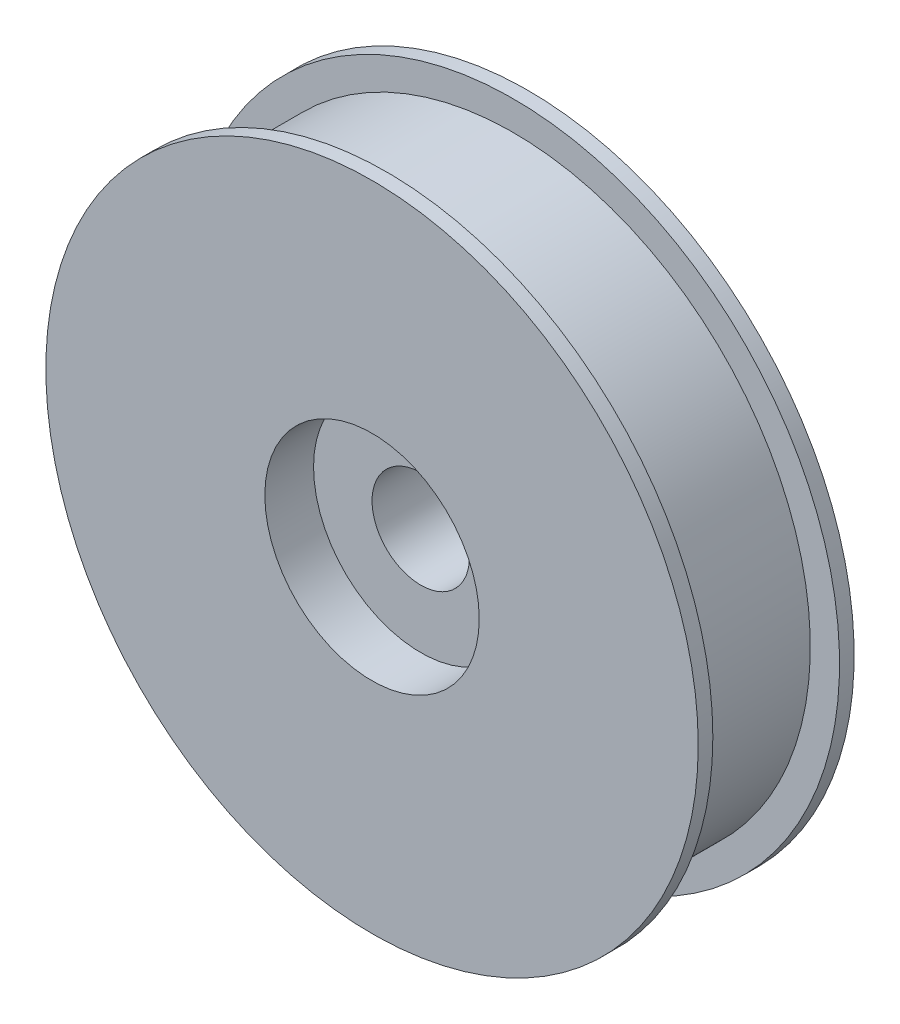
ISO-10303-21;
HEADER;
FILE_DESCRIPTION(('STEP AP214'),'2;1');
FILE_NAME('part.step','',(''),(''),'','','');
FILE_SCHEMA(('AUTOMOTIVE_DESIGN { 1 0 10303 214 1 1 1 1 }'));
ENDSEC;
DATA;
#1=APPLICATION_CONTEXT('core data for automotive mechanical design processes');
#2=APPLICATION_PROTOCOL_DEFINITION('international standard','automotive_design',2000,#1);
#3=PRODUCT_CONTEXT('',#1,'mechanical');
#4=PRODUCT('Part','Part','',(#3));
#5=PRODUCT_RELATED_PRODUCT_CATEGORY('part','',(#4));
#6=PRODUCT_DEFINITION_FORMATION('','',#4);
#7=PRODUCT_DEFINITION_CONTEXT('part definition',#1,'design');
#8=PRODUCT_DEFINITION('design','',#6,#7);
#9=PRODUCT_DEFINITION_SHAPE('','',#8);
#10=(LENGTH_UNIT() NAMED_UNIT(*) SI_UNIT(.MILLI.,.METRE.));
#11=(NAMED_UNIT(*) PLANE_ANGLE_UNIT() SI_UNIT($,.RADIAN.));
#12=(NAMED_UNIT(*) SI_UNIT($,.STERADIAN.) SOLID_ANGLE_UNIT());
#13=UNCERTAINTY_MEASURE_WITH_UNIT(LENGTH_MEASURE(1.E-05),#10,'distance_accuracy_value','');
#14=(GEOMETRIC_REPRESENTATION_CONTEXT(3) GLOBAL_UNCERTAINTY_ASSIGNED_CONTEXT((#13)) GLOBAL_UNIT_ASSIGNED_CONTEXT((#10,
#11,#12)) REPRESENTATION_CONTEXT('',''));
#15=CARTESIAN_POINT('',(0.,0.,0.));
#16=DIRECTION('',(0.,0.,1.));
#17=DIRECTION('',(1.,0.,0.));
#18=AXIS2_PLACEMENT_3D('',#15,#16,#17);
#19=CARTESIAN_POINT('',(0.,0.,-1.5));
#20=DIRECTION('',(0.,0.,1.));
#21=DIRECTION('',(1.,0.,0.));
#22=AXIS2_PLACEMENT_3D('',#19,#20,#21);
#23=CYLINDRICAL_SURFACE('',#22,5.);
#24=CARTESIAN_POINT('',(0.,0.,-1.5));
#25=DIRECTION('',(0.,0.,1.));
#26=DIRECTION('',(1.,0.,0.));
#27=AXIS2_PLACEMENT_3D('',#24,#25,#26);
#28=CIRCLE('',#27,5.);
#29=CARTESIAN_POINT('',(5.,0.,-1.5));
#30=VERTEX_POINT('',#29);
#31=EDGE_CURVE('E55',#30,#30,#28,.T.);
#32=ORIENTED_EDGE('',*,*,#31,.F.);
#33=EDGE_LOOP('',(#32));
#34=FACE_BOUND('',#33,.T.);
#35=CARTESIAN_POINT('',(0.,0.,9.5));
#36=DIRECTION('',(0.,0.,1.));
#37=DIRECTION('',(1.,0.,0.));
#38=AXIS2_PLACEMENT_3D('',#35,#36,#37);
#39=CIRCLE('',#38,5.);
#40=CARTESIAN_POINT('',(5.,0.,9.5));
#41=VERTEX_POINT('',#40);
#42=EDGE_CURVE('E35',#41,#41,#39,.F.);
#43=ORIENTED_EDGE('',*,*,#42,.F.);
#44=EDGE_LOOP('',(#43));
#45=FACE_BOUND('',#44,.T.);
#46=ADVANCED_FACE('F31',(#34,#45),#23,.F.);
#47=CARTESIAN_POINT('',(0.,0.,13.));
#48=DIRECTION('',(0.,0.,-1.));
#49=DIRECTION('',(-1.,0.,0.));
#50=AXIS2_PLACEMENT_3D('',#47,#48,#49);
#51=CYLINDRICAL_SURFACE('',#50,30.47);
#52=CARTESIAN_POINT('',(0.,0.,13.));
#53=DIRECTION('',(0.,0.,1.));
#54=DIRECTION('',(1.,0.,0.));
#55=AXIS2_PLACEMENT_3D('',#52,#53,#54);
#56=CIRCLE('',#55,30.47);
#57=CARTESIAN_POINT('',(-30.47,0.,13.));
#58=VERTEX_POINT('',#57);
#59=EDGE_CURVE('E10',#58,#58,#56,.T.);
#60=CARTESIAN_POINT('',(0.,0.,0.));
#61=DIRECTION('',(0.,0.,-1.));
#62=DIRECTION('',(-1.,0.,0.));
#63=AXIS2_PLACEMENT_3D('',#60,#61,#62);
#64=CIRCLE('',#63,30.47);
#65=CARTESIAN_POINT('',(-30.47,0.,0.));
#66=VERTEX_POINT('',#65);
#67=EDGE_CURVE('E47',#66,#66,#64,.T.);
#68=CARTESIAN_POINT('',(-30.47,0.,13.));
#69=CARTESIAN_POINT('',(-30.47,0.,12.8645833333333));
#70=CARTESIAN_POINT('',(-30.47,0.,12.7291666666667));
#71=CARTESIAN_POINT('',(-30.47,0.,12.4583333333333));
#72=CARTESIAN_POINT('',(-30.47,0.,12.3229166666667));
#73=CARTESIAN_POINT('',(-30.47,0.,12.0520833333333));
#74=CARTESIAN_POINT('',(-30.47,0.,11.9166666666667));
#75=CARTESIAN_POINT('',(-30.47,0.,11.6458333333333));
#76=CARTESIAN_POINT('',(-30.47,0.,11.5104166666667));
#77=CARTESIAN_POINT('',(-30.47,0.,11.2395833333333));
#78=CARTESIAN_POINT('',(-30.47,0.,11.1041666666667));
#79=CARTESIAN_POINT('',(-30.47,0.,10.8333333333333));
#80=CARTESIAN_POINT('',(-30.47,0.,10.6979166666667));
#81=CARTESIAN_POINT('',(-30.47,0.,10.4270833333333));
#82=CARTESIAN_POINT('',(-30.47,0.,10.2916666666667));
#83=CARTESIAN_POINT('',(-30.47,0.,10.0208333333333));
#84=CARTESIAN_POINT('',(-30.47,0.,9.88541666666667));
#85=CARTESIAN_POINT('',(-30.47,0.,9.61458333333333));
#86=CARTESIAN_POINT('',(-30.47,0.,9.47916666666667));
#87=CARTESIAN_POINT('',(-30.47,0.,9.20833333333333));
#88=CARTESIAN_POINT('',(-30.47,0.,9.07291666666666));
#89=CARTESIAN_POINT('',(-30.47,0.,8.80208333333333));
#90=CARTESIAN_POINT('',(-30.47,0.,8.66666666666667));
#91=CARTESIAN_POINT('',(-30.47,0.,8.39583333333333));
#92=CARTESIAN_POINT('',(-30.47,0.,8.26041666666667));
#93=CARTESIAN_POINT('',(-30.47,0.,7.98958333333333));
#94=CARTESIAN_POINT('',(-30.47,0.,7.85416666666667));
#95=CARTESIAN_POINT('',(-30.47,0.,7.58333333333333));
#96=CARTESIAN_POINT('',(-30.47,0.,7.44791666666667));
#97=CARTESIAN_POINT('',(-30.47,0.,7.17708333333333));
#98=CARTESIAN_POINT('',(-30.47,0.,7.04166666666667));
#99=CARTESIAN_POINT('',(-30.47,0.,6.77083333333333));
#100=CARTESIAN_POINT('',(-30.47,0.,6.63541666666667));
#101=CARTESIAN_POINT('',(-30.47,0.,6.36458333333333));
#102=CARTESIAN_POINT('',(-30.47,0.,6.22916666666667));
#103=CARTESIAN_POINT('',(-30.47,0.,5.95833333333333));
#104=CARTESIAN_POINT('',(-30.47,0.,5.82291666666667));
#105=CARTESIAN_POINT('',(-30.47,0.,5.55208333333333));
#106=CARTESIAN_POINT('',(-30.47,0.,5.41666666666667));
#107=CARTESIAN_POINT('',(-30.47,0.,5.14583333333333));
#108=CARTESIAN_POINT('',(-30.47,0.,5.01041666666667));
#109=CARTESIAN_POINT('',(-30.47,0.,4.73958333333333));
#110=CARTESIAN_POINT('',(-30.47,0.,4.60416666666667));
#111=CARTESIAN_POINT('',(-30.47,0.,4.33333333333333));
#112=CARTESIAN_POINT('',(-30.47,0.,4.19791666666667));
#113=CARTESIAN_POINT('',(-30.47,0.,3.92708333333333));
#114=CARTESIAN_POINT('',(-30.47,0.,3.79166666666667));
#115=CARTESIAN_POINT('',(-30.47,0.,3.52083333333333));
#116=CARTESIAN_POINT('',(-30.47,0.,3.38541666666667));
#117=CARTESIAN_POINT('',(-30.47,0.,3.11458333333333));
#118=CARTESIAN_POINT('',(-30.47,0.,2.97916666666667));
#119=CARTESIAN_POINT('',(-30.47,0.,2.70833333333333));
#120=CARTESIAN_POINT('',(-30.47,0.,2.57291666666667));
#121=CARTESIAN_POINT('',(-30.47,0.,2.30208333333333));
#122=CARTESIAN_POINT('',(-30.47,0.,2.16666666666667));
#123=CARTESIAN_POINT('',(-30.47,0.,1.89583333333333));
#124=CARTESIAN_POINT('',(-30.47,0.,1.76041666666667));
#125=CARTESIAN_POINT('',(-30.47,0.,1.48958333333333));
#126=CARTESIAN_POINT('',(-30.47,0.,1.35416666666667));
#127=CARTESIAN_POINT('',(-30.47,0.,1.08333333333333));
#128=CARTESIAN_POINT('',(-30.47,0.,0.947916666666667));
#129=CARTESIAN_POINT('',(-30.47,0.,0.677083333333334));
#130=CARTESIAN_POINT('',(-30.47,0.,0.541666666666667));
#131=CARTESIAN_POINT('',(-30.47,0.,0.270833333333334));
#132=CARTESIAN_POINT('',(-30.47,0.,0.135416666666667));
#133=CARTESIAN_POINT('',(-30.47,0.,0.));
#134=B_SPLINE_CURVE_WITH_KNOTS('',3,(#68,#69,#70,#71,#72,#73,#74,#75,#76,#77,#78,#79,#80,#81,
#82,#83,#84,#85,#86,#87,#88,#89,#90,#91,#92,#93,#94,#95,#96,#97,#98,#99,#100,#101,#102,#103,
#104,#105,#106,#107,#108,#109,#110,#111,#112,#113,#114,#115,#116,#117,#118,#119,#120,#121,#122,
#123,#124,#125,#126,#127,#128,#129,#130,#131,#132,#133),.UNSPECIFIED.,.F.,.F.,(4,2,2,2,2,2,2,2,
2,2,2,2,2,2,2,2,2,2,2,2,2,2,2,2,2,2,2,2,2,2,2,2,4),(0.,0.40625,0.812500000000001,1.21875,1.625,
2.03125,2.4375,2.84375,3.25,3.65625,4.0625,4.46875,4.875,5.28125,5.6875,6.09375,6.5,6.90625,
7.3125,7.71875,8.125,8.53125,8.9375,9.34375,9.75,10.15625,10.5625,10.96875,11.375,11.78125,
12.1875,12.59375,13.),.UNSPECIFIED.);
#135=EDGE_CURVE('BSEAM33',#58,#66,#134,.T.);
#136=ORIENTED_EDGE('',*,*,#59,.F.);
#137=ORIENTED_EDGE('',*,*,#67,.F.);
#138=ORIENTED_EDGE('',*,*,#135,.T.);
#139=ORIENTED_EDGE('',*,*,#135,.F.);
#140=EDGE_LOOP('',(#136,#138,#137,#139));
#141=FACE_BOUND('',#140,.T.);
#142=ADVANCED_FACE('F33',(#141),#51,.T.);
#143=CARTESIAN_POINT('',(0.,0.,13.));
#144=DIRECTION('',(0.,0.,1.));
#145=DIRECTION('',(1.,0.,0.));
#146=AXIS2_PLACEMENT_3D('',#143,#144,#145);
#147=PLANE('',#146);
#148=CARTESIAN_POINT('',(0.,0.,13.));
#149=DIRECTION('',(0.,0.,1.));
#150=DIRECTION('',(1.,0.,0.));
#151=AXIS2_PLACEMENT_3D('',#148,#149,#150);
#152=CIRCLE('',#151,33.47);
#153=CARTESIAN_POINT('',(33.47,0.,13.));
#154=VERTEX_POINT('',#153);
#155=EDGE_CURVE('E43',#154,#154,#152,.T.);
#156=ORIENTED_EDGE('',*,*,#155,.F.);
#157=EDGE_LOOP('',(#156));
#158=FACE_BOUND('',#157,.T.);
#159=ORIENTED_EDGE('',*,*,#59,.T.);
#160=EDGE_LOOP('',(#159));
#161=FACE_BOUND('',#160,.T.);
#162=ADVANCED_FACE('F78',(#158,#161),#147,.F.);
#163=CARTESIAN_POINT('',(0.,0.,14.5));
#164=DIRECTION('',(0.,0.,-1.));
#165=DIRECTION('',(-1.,0.,0.));
#166=AXIS2_PLACEMENT_3D('',#163,#164,#165);
#167=CYLINDRICAL_SURFACE('',#166,33.47);
#168=CARTESIAN_POINT('',(0.,0.,14.5));
#169=DIRECTION('',(0.,0.,1.));
#170=DIRECTION('',(1.,0.,0.));
#171=AXIS2_PLACEMENT_3D('',#168,#169,#170);
#172=CIRCLE('',#171,33.47);
#173=CARTESIAN_POINT('',(33.47,0.,14.5));
#174=VERTEX_POINT('',#173);
#175=EDGE_CURVE('E39',#174,#174,#172,.T.);
#176=ORIENTED_EDGE('',*,*,#175,.F.);
#177=EDGE_LOOP('',(#176));
#178=FACE_BOUND('',#177,.T.);
#179=ORIENTED_EDGE('',*,*,#155,.T.);
#180=EDGE_LOOP('',(#179));
#181=FACE_BOUND('',#180,.T.);
#182=ADVANCED_FACE('F100',(#178,#181),#167,.T.);
#183=CARTESIAN_POINT('',(0.,0.,14.5));
#184=DIRECTION('',(0.,0.,1.));
#185=DIRECTION('',(1.,0.,0.));
#186=AXIS2_PLACEMENT_3D('',#183,#184,#185);
#187=PLANE('',#186);
#188=CARTESIAN_POINT('',(0.,0.,14.5));
#189=DIRECTION('',(0.,0.,1.));
#190=DIRECTION('',(1.,0.,0.));
#191=AXIS2_PLACEMENT_3D('',#188,#189,#190);
#192=CIRCLE('',#191,11.);
#193=CARTESIAN_POINT('',(11.,0.,14.5));
#194=VERTEX_POINT('',#193);
#195=EDGE_CURVE('E60',#194,#194,#192,.T.);
#196=ORIENTED_EDGE('',*,*,#195,.F.);
#197=EDGE_LOOP('',(#196));
#198=FACE_BOUND('',#197,.T.);
#199=ORIENTED_EDGE('',*,*,#175,.T.);
#200=EDGE_LOOP('',(#199));
#201=FACE_BOUND('',#200,.T.);
#202=ADVANCED_FACE('F93',(#198,#201),#187,.T.);
#203=CARTESIAN_POINT('',(0.,0.,0.));
#204=DIRECTION('',(0.,0.,-1.));
#205=DIRECTION('',(-1.,0.,0.));
#206=AXIS2_PLACEMENT_3D('',#203,#204,#205);
#207=PLANE('',#206);
#208=CARTESIAN_POINT('',(0.,0.,0.));
#209=DIRECTION('',(0.,0.,-1.));
#210=DIRECTION('',(-1.,0.,0.));
#211=AXIS2_PLACEMENT_3D('',#208,#209,#210);
#212=CIRCLE('',#211,33.47);
#213=CARTESIAN_POINT('',(-33.47,0.,0.));
#214=VERTEX_POINT('',#213);
#215=EDGE_CURVE('E52',#214,#214,#212,.T.);
#216=ORIENTED_EDGE('',*,*,#215,.F.);
#217=EDGE_LOOP('',(#216));
#218=FACE_BOUND('',#217,.T.);
#219=ORIENTED_EDGE('',*,*,#67,.T.);
#220=EDGE_LOOP('',(#219));
#221=FACE_BOUND('',#220,.T.);
#222=ADVANCED_FACE('F90',(#218,#221),#207,.F.);
#223=CARTESIAN_POINT('',(0.,0.,-1.5));
#224=DIRECTION('',(0.,0.,1.));
#225=DIRECTION('',(1.,0.,0.));
#226=AXIS2_PLACEMENT_3D('',#223,#224,#225);
#227=CYLINDRICAL_SURFACE('',#226,33.47);
#228=CARTESIAN_POINT('',(0.,0.,-1.5));
#229=DIRECTION('',(0.,0.,-1.));
#230=DIRECTION('',(-1.,0.,0.));
#231=AXIS2_PLACEMENT_3D('',#228,#229,#230);
#232=CIRCLE('',#231,33.47);
#233=CARTESIAN_POINT('',(-33.47,0.,-1.5));
#234=VERTEX_POINT('',#233);
#235=EDGE_CURVE('E51',#234,#234,#232,.T.);
#236=ORIENTED_EDGE('',*,*,#235,.F.);
#237=EDGE_LOOP('',(#236));
#238=FACE_BOUND('',#237,.T.);
#239=ORIENTED_EDGE('',*,*,#215,.T.);
#240=EDGE_LOOP('',(#239));
#241=FACE_BOUND('',#240,.T.);
#242=ADVANCED_FACE('F88',(#238,#241),#227,.T.);
#243=CARTESIAN_POINT('',(0.,0.,-1.5));
#244=DIRECTION('',(0.,0.,-1.));
#245=DIRECTION('',(-1.,0.,0.));
#246=AXIS2_PLACEMENT_3D('',#243,#244,#245);
#247=PLANE('',#246);
#248=ORIENTED_EDGE('',*,*,#31,.T.);
#249=EDGE_LOOP('',(#248));
#250=FACE_BOUND('',#249,.T.);
#251=ORIENTED_EDGE('',*,*,#235,.T.);
#252=EDGE_LOOP('',(#251));
#253=FACE_BOUND('',#252,.T.);
#254=ADVANCED_FACE('F85',(#250,#253),#247,.T.);
#255=CARTESIAN_POINT('',(0.,0.,9.5));
#256=DIRECTION('',(0.,0.,1.));
#257=DIRECTION('',(1.,0.,0.));
#258=AXIS2_PLACEMENT_3D('',#255,#256,#257);
#259=PLANE('',#258);
#260=CARTESIAN_POINT('',(0.,0.,9.5));
#261=DIRECTION('',(0.,0.,1.));
#262=DIRECTION('',(1.,0.,0.));
#263=AXIS2_PLACEMENT_3D('',#260,#261,#262);
#264=CIRCLE('',#263,11.);
#265=CARTESIAN_POINT('',(11.,0.,9.5));
#266=VERTEX_POINT('',#265);
#267=EDGE_CURVE('E63',#266,#266,#264,.T.);
#268=ORIENTED_EDGE('',*,*,#267,.T.);
#269=EDGE_LOOP('',(#268));
#270=FACE_BOUND('',#269,.T.);
#271=ORIENTED_EDGE('',*,*,#42,.T.);
#272=EDGE_LOOP('',(#271));
#273=FACE_BOUND('',#272,.T.);
#274=ADVANCED_FACE('F70',(#270,#273),#259,.T.);
#275=CARTESIAN_POINT('',(0.,0.,9.5));
#276=DIRECTION('',(0.,0.,1.));
#277=DIRECTION('',(1.,0.,0.));
#278=AXIS2_PLACEMENT_3D('',#275,#276,#277);
#279=CYLINDRICAL_SURFACE('',#278,11.);
#280=ORIENTED_EDGE('',*,*,#267,.F.);
#281=EDGE_LOOP('',(#280));
#282=FACE_BOUND('',#281,.T.);
#283=ORIENTED_EDGE('',*,*,#195,.T.);
#284=EDGE_LOOP('',(#283));
#285=FACE_BOUND('',#284,.T.);
#286=ADVANCED_FACE('F83',(#282,#285),#279,.F.);
#287=CLOSED_SHELL('',(#46,#142,#162,#182,#202,#222,#242,#254,#274,#286));
#288=MANIFOLD_SOLID_BREP('B2',#287);
#289=ADVANCED_BREP_SHAPE_REPRESENTATION('',(#18,#288),#14);
#290=SHAPE_DEFINITION_REPRESENTATION(#9,#289);
ENDSEC;
END-ISO-10303-21;
